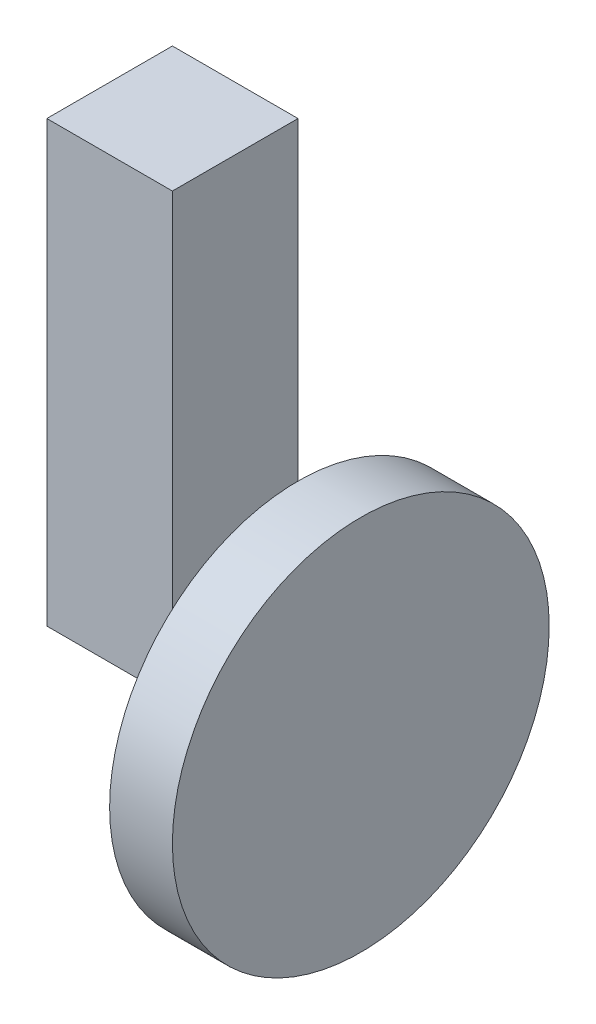
ISO-10303-21;
HEADER;
FILE_DESCRIPTION(('STEP AP214'),'2;1');
FILE_NAME('part.step','',(''),(''),'','','');
FILE_SCHEMA(('AUTOMOTIVE_DESIGN { 1 0 10303 214 1 1 1 1 }'));
ENDSEC;
DATA;
#1=APPLICATION_CONTEXT('core data for automotive mechanical design processes');
#2=APPLICATION_PROTOCOL_DEFINITION('international standard','automotive_design',2000,#1);
#3=PRODUCT_CONTEXT('',#1,'mechanical');
#4=PRODUCT('Part','Part','',(#3));
#5=PRODUCT_RELATED_PRODUCT_CATEGORY('part','',(#4));
#6=PRODUCT_DEFINITION_FORMATION('','',#4);
#7=PRODUCT_DEFINITION_CONTEXT('part definition',#1,'design');
#8=PRODUCT_DEFINITION('design','',#6,#7);
#9=PRODUCT_DEFINITION_SHAPE('','',#8);
#10=(LENGTH_UNIT() NAMED_UNIT(*) SI_UNIT(.MILLI.,.METRE.));
#11=(NAMED_UNIT(*) PLANE_ANGLE_UNIT() SI_UNIT($,.RADIAN.));
#12=(NAMED_UNIT(*) SI_UNIT($,.STERADIAN.) SOLID_ANGLE_UNIT());
#13=UNCERTAINTY_MEASURE_WITH_UNIT(LENGTH_MEASURE(1.E-05),#10,'distance_accuracy_value','');
#14=(GEOMETRIC_REPRESENTATION_CONTEXT(3) GLOBAL_UNCERTAINTY_ASSIGNED_CONTEXT((#13)) GLOBAL_UNIT_ASSIGNED_CONTEXT((#10,
#11,#12)) REPRESENTATION_CONTEXT('',''));
#15=CARTESIAN_POINT('',(0.,0.,0.));
#16=DIRECTION('',(0.,0.,1.));
#17=DIRECTION('',(1.,0.,0.));
#18=AXIS2_PLACEMENT_3D('',#15,#16,#17);
#19=CARTESIAN_POINT('',(10.,-70.,10.));
#20=DIRECTION('',(1.,0.,0.));
#21=DIRECTION('',(0.,0.,-1.));
#22=AXIS2_PLACEMENT_3D('',#19,#20,#21);
#23=PLANE('',#22);
#24=DIRECTION('',(0.,0.,1.));
#25=VECTOR('',#24,1.);
#26=CARTESIAN_POINT('',(10.,-60.,10.));
#27=LINE('',#26,#25);
#28=CARTESIAN_POINT('',(10.,-60.,-10.));
#29=VERTEX_POINT('',#28);
#30=CARTESIAN_POINT('',(10.,-60.,10.));
#31=VERTEX_POINT('',#30);
#32=EDGE_CURVE('E59',#29,#31,#27,.T.);
#33=ORIENTED_EDGE('',*,*,#32,.F.);
#34=DIRECTION('',(0.,1.,0.));
#35=VECTOR('',#34,1.);
#36=CARTESIAN_POINT('',(10.,-70.,-10.));
#37=LINE('',#36,#35);
#38=CARTESIAN_POINT('',(10.,0.,-10.));
#39=VERTEX_POINT('',#38);
#40=EDGE_CURVE('E46',#29,#39,#37,.T.);
#41=ORIENTED_EDGE('',*,*,#40,.T.);
#42=DIRECTION('',(0.,0.,-1.));
#43=VECTOR('',#42,1.);
#44=CARTESIAN_POINT('',(10.,0.,10.));
#45=LINE('',#44,#43);
#46=CARTESIAN_POINT('',(10.,0.,10.));
#47=VERTEX_POINT('',#46);
#48=EDGE_CURVE('E156',#47,#39,#45,.T.);
#49=ORIENTED_EDGE('',*,*,#48,.F.);
#50=DIRECTION('',(0.,1.,0.));
#51=VECTOR('',#50,1.);
#52=CARTESIAN_POINT('',(10.,-70.,10.));
#53=LINE('',#52,#51);
#54=EDGE_CURVE('E12',#31,#47,#53,.T.);
#55=ORIENTED_EDGE('',*,*,#54,.F.);
#56=EDGE_LOOP('',(#33,#41,#49,#55));
#57=FACE_BOUND('',#56,.T.);
#58=ADVANCED_FACE('F43',(#57),#23,.T.);
#59=CARTESIAN_POINT('',(-10.,-70.,10.));
#60=DIRECTION('',(0.,0.,1.));
#61=DIRECTION('',(1.,0.,0.));
#62=AXIS2_PLACEMENT_3D('',#59,#60,#61);
#63=PLANE('',#62);
#64=DIRECTION('',(1.,0.,0.));
#65=VECTOR('',#64,1.);
#66=CARTESIAN_POINT('',(-10.,0.,10.));
#67=LINE('',#66,#65);
#68=CARTESIAN_POINT('',(-10.,0.,10.));
#69=VERTEX_POINT('',#68);
#70=EDGE_CURVE('E158',#69,#47,#67,.T.);
#71=ORIENTED_EDGE('',*,*,#70,.F.);
#72=DIRECTION('',(0.,1.,0.));
#73=VECTOR('',#72,1.);
#74=CARTESIAN_POINT('',(-10.,-70.,10.));
#75=LINE('',#74,#73);
#76=CARTESIAN_POINT('',(-10.,-70.,10.));
#77=VERTEX_POINT('',#76);
#78=EDGE_CURVE('E51',#77,#69,#75,.T.);
#79=ORIENTED_EDGE('',*,*,#78,.F.);
#80=DIRECTION('',(1.,0.,0.));
#81=VECTOR('',#80,1.);
#82=CARTESIAN_POINT('',(-10.,-70.,10.));
#83=LINE('',#82,#81);
#84=CARTESIAN_POINT('',(10.,-70.,10.));
#85=VERTEX_POINT('',#84);
#86=EDGE_CURVE('E163',#77,#85,#83,.T.);
#87=ORIENTED_EDGE('',*,*,#86,.T.);
#88=DIRECTION('',(0.,-1.,0.));
#89=VECTOR('',#88,1.);
#90=CARTESIAN_POINT('',(10.,-60.,10.));
#91=LINE('',#90,#89);
#92=CARTESIAN_POINT('',(10.,-80.,10.));
#93=VERTEX_POINT('',#92);
#94=EDGE_CURVE('E142',#85,#93,#91,.T.);
#95=ORIENTED_EDGE('',*,*,#94,.T.);
#96=DIRECTION('',(-1.,0.,0.));
#97=VECTOR('',#96,1.);
#98=CARTESIAN_POINT('',(20.,-80.,10.));
#99=LINE('',#98,#97);
#100=CARTESIAN_POINT('',(20.,-80.,10.));
#101=VERTEX_POINT('',#100);
#102=EDGE_CURVE('E120',#101,#93,#99,.T.);
#103=ORIENTED_EDGE('',*,*,#102,.F.);
#104=DIRECTION('',(0.,-1.,0.));
#105=VECTOR('',#104,1.);
#106=CARTESIAN_POINT('',(20.,-60.,10.));
#107=LINE('',#106,#105);
#108=CARTESIAN_POINT('',(20.,-60.,10.));
#109=VERTEX_POINT('',#108);
#110=EDGE_CURVE('E115',#109,#101,#107,.T.);
#111=ORIENTED_EDGE('',*,*,#110,.F.);
#112=DIRECTION('',(-1.,0.,0.));
#113=VECTOR('',#112,1.);
#114=CARTESIAN_POINT('',(20.,-60.,10.));
#115=LINE('',#114,#113);
#116=EDGE_CURVE('E118',#109,#31,#115,.T.);
#117=ORIENTED_EDGE('',*,*,#116,.T.);
#118=ORIENTED_EDGE('',*,*,#54,.T.);
#119=EDGE_LOOP('',(#71,#79,#87,#95,#103,#111,#117,#118));
#120=FACE_BOUND('',#119,.T.);
#121=ADVANCED_FACE('F117',(#120),#63,.T.);
#122=CARTESIAN_POINT('',(-10.,-70.,10.));
#123=DIRECTION('',(-1.,0.,0.));
#124=DIRECTION('',(0.,0.,1.));
#125=AXIS2_PLACEMENT_3D('',#122,#123,#124);
#126=PLANE('',#125);
#127=DIRECTION('',(0.,0.,1.));
#128=VECTOR('',#127,1.);
#129=CARTESIAN_POINT('',(-10.,0.,10.));
#130=LINE('',#129,#128);
#131=CARTESIAN_POINT('',(-10.,0.,-10.));
#132=VERTEX_POINT('',#131);
#133=EDGE_CURVE('E170',#132,#69,#130,.T.);
#134=ORIENTED_EDGE('',*,*,#133,.F.);
#135=DIRECTION('',(0.,1.,0.));
#136=VECTOR('',#135,1.);
#137=CARTESIAN_POINT('',(-10.,-70.,-10.));
#138=LINE('',#137,#136);
#139=CARTESIAN_POINT('',(-10.,-70.,-10.));
#140=VERTEX_POINT('',#139);
#141=EDGE_CURVE('E175',#140,#132,#138,.T.);
#142=ORIENTED_EDGE('',*,*,#141,.F.);
#143=DIRECTION('',(0.,0.,1.));
#144=VECTOR('',#143,1.);
#145=CARTESIAN_POINT('',(-10.,-70.,10.));
#146=LINE('',#145,#144);
#147=EDGE_CURVE('E160',#140,#77,#146,.T.);
#148=ORIENTED_EDGE('',*,*,#147,.T.);
#149=ORIENTED_EDGE('',*,*,#78,.T.);
#150=EDGE_LOOP('',(#134,#142,#148,#149));
#151=FACE_BOUND('',#150,.T.);
#152=ADVANCED_FACE('F184',(#151),#126,.T.);
#153=CARTESIAN_POINT('',(-10.,-70.,-10.));
#154=DIRECTION('',(0.,0.,-1.));
#155=DIRECTION('',(-1.,0.,0.));
#156=AXIS2_PLACEMENT_3D('',#153,#154,#155);
#157=PLANE('',#156);
#158=DIRECTION('',(-1.,0.,0.));
#159=VECTOR('',#158,1.);
#160=CARTESIAN_POINT('',(-10.,0.,-10.));
#161=LINE('',#160,#159);
#162=EDGE_CURVE('E167',#39,#132,#161,.T.);
#163=ORIENTED_EDGE('',*,*,#162,.F.);
#164=ORIENTED_EDGE('',*,*,#40,.F.);
#165=DIRECTION('',(-1.,0.,0.));
#166=VECTOR('',#165,1.);
#167=CARTESIAN_POINT('',(20.,-60.,-10.));
#168=LINE('',#167,#166);
#169=CARTESIAN_POINT('',(20.,-60.,-10.));
#170=VERTEX_POINT('',#169);
#171=EDGE_CURVE('E132',#170,#29,#168,.T.);
#172=ORIENTED_EDGE('',*,*,#171,.F.);
#173=DIRECTION('',(0.,1.,0.));
#174=VECTOR('',#173,1.);
#175=CARTESIAN_POINT('',(20.,-60.,-10.));
#176=LINE('',#175,#174);
#177=CARTESIAN_POINT('',(20.,-80.,-10.));
#178=VERTEX_POINT('',#177);
#179=EDGE_CURVE('E137',#178,#170,#176,.T.);
#180=ORIENTED_EDGE('',*,*,#179,.F.);
#181=DIRECTION('',(-1.,0.,0.));
#182=VECTOR('',#181,1.);
#183=CARTESIAN_POINT('',(20.,-80.,-10.));
#184=LINE('',#183,#182);
#185=CARTESIAN_POINT('',(10.,-80.,-10.));
#186=VERTEX_POINT('',#185);
#187=EDGE_CURVE('E152',#178,#186,#184,.T.);
#188=ORIENTED_EDGE('',*,*,#187,.T.);
#189=DIRECTION('',(0.,1.,0.));
#190=VECTOR('',#189,1.);
#191=CARTESIAN_POINT('',(10.,-60.,-10.));
#192=LINE('',#191,#190);
#193=CARTESIAN_POINT('',(10.,-70.,-10.));
#194=VERTEX_POINT('',#193);
#195=EDGE_CURVE('E147',#186,#194,#192,.T.);
#196=ORIENTED_EDGE('',*,*,#195,.T.);
#197=DIRECTION('',(-1.,0.,0.));
#198=VECTOR('',#197,1.);
#199=CARTESIAN_POINT('',(-10.,-70.,-10.));
#200=LINE('',#199,#198);
#201=EDGE_CURVE('E92',#194,#140,#200,.T.);
#202=ORIENTED_EDGE('',*,*,#201,.T.);
#203=ORIENTED_EDGE('',*,*,#141,.T.);
#204=EDGE_LOOP('',(#163,#164,#172,#180,#188,#196,#202,#203));
#205=FACE_BOUND('',#204,.T.);
#206=ADVANCED_FACE('F179',(#205),#157,.T.);
#207=CARTESIAN_POINT('',(0.,-70.,0.));
#208=DIRECTION('',(0.,-1.,0.));
#209=DIRECTION('',(0.,0.,-1.));
#210=AXIS2_PLACEMENT_3D('',#207,#208,#209);
#211=PLANE('',#210);
#212=DIRECTION('',(0.,0.,-1.));
#213=VECTOR('',#212,1.);
#214=CARTESIAN_POINT('',(10.,-70.,10.));
#215=LINE('',#214,#213);
#216=EDGE_CURVE('E68',#85,#194,#215,.T.);
#217=ORIENTED_EDGE('',*,*,#216,.F.);
#218=ORIENTED_EDGE('',*,*,#86,.F.);
#219=ORIENTED_EDGE('',*,*,#147,.F.);
#220=ORIENTED_EDGE('',*,*,#201,.F.);
#221=EDGE_LOOP('',(#217,#218,#219,#220));
#222=FACE_BOUND('',#221,.T.);
#223=ADVANCED_FACE('F185',(#222),#211,.T.);
#224=CARTESIAN_POINT('',(0.,0.,0.));
#225=DIRECTION('',(0.,-1.,0.));
#226=DIRECTION('',(0.,0.,-1.));
#227=AXIS2_PLACEMENT_3D('',#224,#225,#226);
#228=PLANE('',#227);
#229=ORIENTED_EDGE('',*,*,#48,.T.);
#230=ORIENTED_EDGE('',*,*,#162,.T.);
#231=ORIENTED_EDGE('',*,*,#133,.T.);
#232=ORIENTED_EDGE('',*,*,#70,.T.);
#233=EDGE_LOOP('',(#229,#230,#231,#232));
#234=FACE_BOUND('',#233,.T.);
#235=ADVANCED_FACE('F181',(#234),#228,.F.);
#236=CARTESIAN_POINT('',(10.,0.,0.));
#237=DIRECTION('',(1.,0.,0.));
#238=DIRECTION('',(0.,0.,-1.));
#239=AXIS2_PLACEMENT_3D('',#236,#237,#238);
#240=PLANE('',#239);
#241=ORIENTED_EDGE('',*,*,#94,.F.);
#242=ORIENTED_EDGE('',*,*,#216,.T.);
#243=ORIENTED_EDGE('',*,*,#195,.F.);
#244=DIRECTION('',(0.,0.,-1.));
#245=VECTOR('',#244,1.);
#246=CARTESIAN_POINT('',(10.,-80.,10.));
#247=LINE('',#246,#245);
#248=EDGE_CURVE('E144',#93,#186,#247,.T.);
#249=ORIENTED_EDGE('',*,*,#248,.F.);
#250=EDGE_LOOP('',(#241,#242,#243,#249));
#251=FACE_BOUND('',#250,.T.);
#252=ADVANCED_FACE('F192',(#251),#240,.F.);
#253=CARTESIAN_POINT('',(20.,-80.,10.));
#254=DIRECTION('',(0.,1.,0.));
#255=DIRECTION('',(0.,0.,1.));
#256=AXIS2_PLACEMENT_3D('',#253,#254,#255);
#257=PLANE('',#256);
#258=ORIENTED_EDGE('',*,*,#248,.T.);
#259=ORIENTED_EDGE('',*,*,#187,.F.);
#260=DIRECTION('',(0.,0.,-1.));
#261=VECTOR('',#260,1.);
#262=CARTESIAN_POINT('',(20.,-80.,10.));
#263=LINE('',#262,#261);
#264=EDGE_CURVE('E124',#101,#178,#263,.T.);
#265=ORIENTED_EDGE('',*,*,#264,.F.);
#266=ORIENTED_EDGE('',*,*,#102,.T.);
#267=EDGE_LOOP('',(#258,#259,#265,#266));
#268=FACE_BOUND('',#267,.T.);
#269=ADVANCED_FACE('F221',(#268),#257,.F.);
#270=CARTESIAN_POINT('',(20.,-60.,10.));
#271=DIRECTION('',(0.,-1.,0.));
#272=DIRECTION('',(0.,0.,-1.));
#273=AXIS2_PLACEMENT_3D('',#270,#271,#272);
#274=PLANE('',#273);
#275=ORIENTED_EDGE('',*,*,#32,.T.);
#276=ORIENTED_EDGE('',*,*,#116,.F.);
#277=DIRECTION('',(0.,0.,1.));
#278=VECTOR('',#277,1.);
#279=CARTESIAN_POINT('',(20.,-60.,10.));
#280=LINE('',#279,#278);
#281=EDGE_CURVE('E130',#170,#109,#280,.T.);
#282=ORIENTED_EDGE('',*,*,#281,.F.);
#283=ORIENTED_EDGE('',*,*,#171,.T.);
#284=EDGE_LOOP('',(#275,#276,#282,#283));
#285=FACE_BOUND('',#284,.T.);
#286=ADVANCED_FACE('F128',(#285),#274,.F.);
#287=CARTESIAN_POINT('',(20.,-70.,0.));
#288=DIRECTION('',(1.,0.,0.));
#289=DIRECTION('',(0.,0.,-1.));
#290=AXIS2_PLACEMENT_3D('',#287,#288,#289);
#291=PLANE('',#290);
#292=ORIENTED_EDGE('',*,*,#281,.T.);
#293=ORIENTED_EDGE('',*,*,#110,.T.);
#294=ORIENTED_EDGE('',*,*,#264,.T.);
#295=ORIENTED_EDGE('',*,*,#179,.T.);
#296=EDGE_LOOP('',(#292,#293,#294,#295));
#297=FACE_BOUND('',#296,.T.);
#298=CARTESIAN_POINT('',(20.,-70.,0.));
#299=DIRECTION('',(1.,0.,0.));
#300=DIRECTION('',(0.,0.,-1.));
#301=AXIS2_PLACEMENT_3D('',#298,#299,#300);
#302=CIRCLE('',#301,30.);
#303=CARTESIAN_POINT('',(20.,-70.,-30.));
#304=VERTEX_POINT('',#303);
#305=EDGE_CURVE('E279',#304,#304,#302,.T.);
#306=ORIENTED_EDGE('',*,*,#305,.F.);
#307=EDGE_LOOP('',(#306));
#308=FACE_BOUND('',#307,.T.);
#309=ADVANCED_FACE('F134',(#297,#308),#291,.F.);
#310=CARTESIAN_POINT('',(30.,-70.,0.));
#311=DIRECTION('',(-1.,0.,0.));
#312=DIRECTION('',(0.,0.,1.));
#313=AXIS2_PLACEMENT_3D('',#310,#311,#312);
#314=CYLINDRICAL_SURFACE('',#313,30.);
#315=CARTESIAN_POINT('',(30.,-70.,0.));
#316=DIRECTION('',(1.,0.,0.));
#317=DIRECTION('',(0.,0.,-1.));
#318=AXIS2_PLACEMENT_3D('',#315,#316,#317);
#319=CIRCLE('',#318,30.);
#320=CARTESIAN_POINT('',(30.,-70.,-30.));
#321=VERTEX_POINT('',#320);
#322=EDGE_CURVE('E145',#321,#321,#319,.T.);
#323=ORIENTED_EDGE('',*,*,#322,.F.);
#324=EDGE_LOOP('',(#323));
#325=FACE_BOUND('',#324,.T.);
#326=ORIENTED_EDGE('',*,*,#305,.T.);
#327=EDGE_LOOP('',(#326));
#328=FACE_BOUND('',#327,.T.);
#329=ADVANCED_FACE('F244',(#325,#328),#314,.T.);
#330=CARTESIAN_POINT('',(30.,-70.,0.));
#331=DIRECTION('',(1.,0.,0.));
#332=DIRECTION('',(0.,0.,-1.));
#333=AXIS2_PLACEMENT_3D('',#330,#331,#332);
#334=PLANE('',#333);
#335=ORIENTED_EDGE('',*,*,#322,.T.);
#336=EDGE_LOOP('',(#335));
#337=FACE_BOUND('',#336,.T.);
#338=ADVANCED_FACE('F254',(#337),#334,.T.);
#339=CLOSED_SHELL('',(#58,#121,#152,#206,#223,#235,#252,#269,#286,#309,#329,#338));
#340=MANIFOLD_SOLID_BREP('B2',#339);
#341=ADVANCED_BREP_SHAPE_REPRESENTATION('',(#18,#340),#14);
#342=SHAPE_DEFINITION_REPRESENTATION(#9,#341);
ENDSEC;
END-ISO-10303-21;
